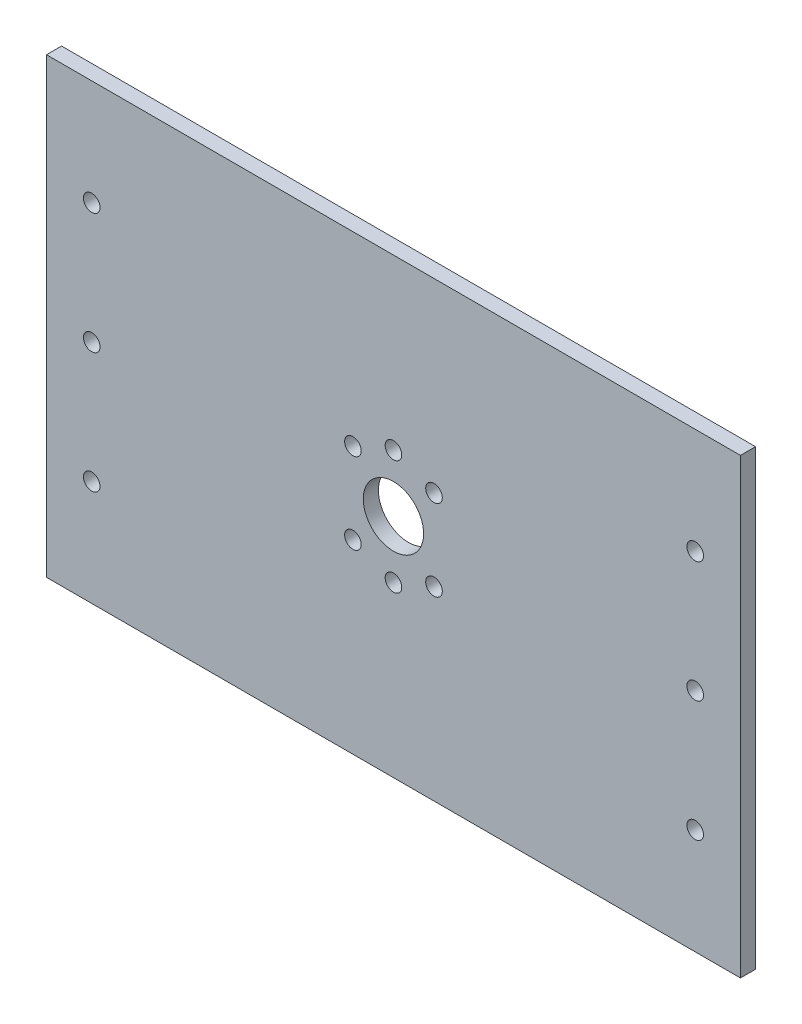
ISO-10303-21;
HEADER;
FILE_DESCRIPTION(('STEP AP214'),'2;1');
FILE_NAME('part.step','',(''),(''),'','','');
FILE_SCHEMA(('AUTOMOTIVE_DESIGN { 1 0 10303 214 1 1 1 1 }'));
ENDSEC;
DATA;
#1=APPLICATION_CONTEXT('core data for automotive mechanical design processes');
#2=APPLICATION_PROTOCOL_DEFINITION('international standard','automotive_design',2000,#1);
#3=PRODUCT_CONTEXT('',#1,'mechanical');
#4=PRODUCT('Part','Part','',(#3));
#5=PRODUCT_RELATED_PRODUCT_CATEGORY('part','',(#4));
#6=PRODUCT_DEFINITION_FORMATION('','',#4);
#7=PRODUCT_DEFINITION_CONTEXT('part definition',#1,'design');
#8=PRODUCT_DEFINITION('design','',#6,#7);
#9=PRODUCT_DEFINITION_SHAPE('','',#8);
#10=(LENGTH_UNIT() NAMED_UNIT(*) SI_UNIT(.MILLI.,.METRE.));
#11=(NAMED_UNIT(*) PLANE_ANGLE_UNIT() SI_UNIT($,.RADIAN.));
#12=(NAMED_UNIT(*) SI_UNIT($,.STERADIAN.) SOLID_ANGLE_UNIT());
#13=UNCERTAINTY_MEASURE_WITH_UNIT(LENGTH_MEASURE(1.E-05),#10,'distance_accuracy_value','');
#14=(GEOMETRIC_REPRESENTATION_CONTEXT(3) GLOBAL_UNCERTAINTY_ASSIGNED_CONTEXT((#13)) GLOBAL_UNIT_ASSIGNED_CONTEXT((#10,
#11,#12)) REPRESENTATION_CONTEXT('',''));
#15=CARTESIAN_POINT('',(0.,0.,0.));
#16=DIRECTION('',(0.,0.,1.));
#17=DIRECTION('',(1.,0.,0.));
#18=AXIS2_PLACEMENT_3D('',#15,#16,#17);
#19=CARTESIAN_POINT('',(0.,0.,5.));
#20=DIRECTION('',(0.,0.,1.));
#21=DIRECTION('',(1.,0.,0.));
#22=AXIS2_PLACEMENT_3D('',#19,#20,#21);
#23=PLANE('',#22);
#24=CARTESIAN_POINT('',(100.,0.,5.));
#25=DIRECTION('',(0.,0.,1.));
#26=DIRECTION('',(-1.,0.,0.));
#27=AXIS2_PLACEMENT_3D('',#24,#25,#26);
#28=CIRCLE('',#27,2.75000000000001);
#29=CARTESIAN_POINT('',(97.25,0.,5.));
#30=VERTEX_POINT('',#29);
#31=EDGE_CURVE('E178',#30,#30,#28,.T.);
#32=ORIENTED_EDGE('',*,*,#31,.F.);
#33=EDGE_LOOP('',(#32));
#34=FACE_BOUND('',#33,.T.);
#35=CARTESIAN_POINT('',(-100.,-40.,5.));
#36=DIRECTION('',(0.,0.,1.));
#37=DIRECTION('',(-1.,0.,0.));
#38=AXIS2_PLACEMENT_3D('',#35,#36,#37);
#39=CIRCLE('',#38,2.75000000000001);
#40=CARTESIAN_POINT('',(-102.75,-40.,5.));
#41=VERTEX_POINT('',#40);
#42=EDGE_CURVE('E166',#41,#41,#39,.T.);
#43=ORIENTED_EDGE('',*,*,#42,.F.);
#44=EDGE_LOOP('',(#43));
#45=FACE_BOUND('',#44,.T.);
#46=CARTESIAN_POINT('',(-100.,0.,5.));
#47=DIRECTION('',(0.,0.,1.));
#48=DIRECTION('',(1.,0.,0.));
#49=AXIS2_PLACEMENT_3D('',#46,#47,#48);
#50=CIRCLE('',#49,2.75000000000001);
#51=CARTESIAN_POINT('',(-97.25,0.,5.));
#52=VERTEX_POINT('',#51);
#53=EDGE_CURVE('E154',#52,#52,#50,.T.);
#54=ORIENTED_EDGE('',*,*,#53,.F.);
#55=EDGE_LOOP('',(#54));
#56=FACE_BOUND('',#55,.T.);
#57=CARTESIAN_POINT('',(-13.4350288425445,-13.4350288425443,5.));
#58=DIRECTION('',(0.,0.,1.));
#59=DIRECTION('',(1.,0.,0.));
#60=AXIS2_PLACEMENT_3D('',#57,#58,#59);
#61=CIRCLE('',#60,2.75);
#62=CARTESIAN_POINT('',(-10.6850288425445,-13.4350288425443,5.));
#63=VERTEX_POINT('',#62);
#64=EDGE_CURVE('E142',#63,#63,#61,.T.);
#65=ORIENTED_EDGE('',*,*,#64,.F.);
#66=EDGE_LOOP('',(#65));
#67=FACE_BOUND('',#66,.T.);
#68=CARTESIAN_POINT('',(-13.4350288425445,13.4350288425443,5.));
#69=DIRECTION('',(0.,0.,1.));
#70=DIRECTION('',(-1.,0.,0.));
#71=AXIS2_PLACEMENT_3D('',#68,#69,#70);
#72=CIRCLE('',#71,2.75);
#73=CARTESIAN_POINT('',(-16.1850288425445,13.4350288425443,5.));
#74=VERTEX_POINT('',#73);
#75=EDGE_CURVE('E130',#74,#74,#72,.T.);
#76=ORIENTED_EDGE('',*,*,#75,.F.);
#77=EDGE_LOOP('',(#76));
#78=FACE_BOUND('',#77,.T.);
#79=CARTESIAN_POINT('',(0.,19.,5.));
#80=DIRECTION('',(0.,0.,1.));
#81=DIRECTION('',(1.,0.,0.));
#82=AXIS2_PLACEMENT_3D('',#79,#80,#81);
#83=CIRCLE('',#82,2.75);
#84=CARTESIAN_POINT('',(2.75,19.,5.));
#85=VERTEX_POINT('',#84);
#86=EDGE_CURVE('E118',#85,#85,#83,.T.);
#87=ORIENTED_EDGE('',*,*,#86,.F.);
#88=EDGE_LOOP('',(#87));
#89=FACE_BOUND('',#88,.T.);
#90=DIRECTION('',(0.,-1.,0.));
#91=VECTOR('',#90,1.);
#92=CARTESIAN_POINT('',(-115.,-75.,5.));
#93=LINE('',#92,#91);
#94=CARTESIAN_POINT('',(-115.,75.,5.));
#95=VERTEX_POINT('',#94);
#96=CARTESIAN_POINT('',(-115.,-75.,5.));
#97=VERTEX_POINT('',#96);
#98=EDGE_CURVE('E88',#95,#97,#93,.T.);
#99=ORIENTED_EDGE('',*,*,#98,.T.);
#100=DIRECTION('',(1.,0.,0.));
#101=VECTOR('',#100,1.);
#102=CARTESIAN_POINT('',(115.,-75.,5.));
#103=LINE('',#102,#101);
#104=CARTESIAN_POINT('',(115.,-75.,5.));
#105=VERTEX_POINT('',#104);
#106=EDGE_CURVE('E83',#97,#105,#103,.T.);
#107=ORIENTED_EDGE('',*,*,#106,.T.);
#108=DIRECTION('',(0.,1.,0.));
#109=VECTOR('',#108,1.);
#110=CARTESIAN_POINT('',(115.,-75.,5.));
#111=LINE('',#110,#109);
#112=CARTESIAN_POINT('',(115.,75.,5.));
#113=VERTEX_POINT('',#112);
#114=EDGE_CURVE('E86',#105,#113,#111,.T.);
#115=ORIENTED_EDGE('',*,*,#114,.T.);
#116=DIRECTION('',(-1.,0.,0.));
#117=VECTOR('',#116,1.);
#118=CARTESIAN_POINT('',(115.,75.,5.));
#119=LINE('',#118,#117);
#120=EDGE_CURVE('E53',#113,#95,#119,.T.);
#121=ORIENTED_EDGE('',*,*,#120,.T.);
#122=EDGE_LOOP('',(#99,#107,#115,#121));
#123=FACE_BOUND('',#122,.T.);
#124=CARTESIAN_POINT('',(0.,0.,5.));
#125=DIRECTION('',(0.,0.,1.));
#126=DIRECTION('',(1.,0.,0.));
#127=AXIS2_PLACEMENT_3D('',#124,#125,#126);
#128=CIRCLE('',#127,10.);
#129=CARTESIAN_POINT('',(10.,0.,5.));
#130=VERTEX_POINT('',#129);
#131=EDGE_CURVE('E103',#130,#130,#128,.T.);
#132=ORIENTED_EDGE('',*,*,#131,.F.);
#133=EDGE_LOOP('',(#132));
#134=FACE_BOUND('',#133,.T.);
#135=CARTESIAN_POINT('',(13.4350288425445,13.4350288425443,5.));
#136=DIRECTION('',(0.,0.,1.));
#137=DIRECTION('',(1.,0.,0.));
#138=AXIS2_PLACEMENT_3D('',#135,#136,#137);
#139=CIRCLE('',#138,2.75);
#140=CARTESIAN_POINT('',(16.1850288425445,13.4350288425443,5.));
#141=VERTEX_POINT('',#140);
#142=EDGE_CURVE('E124',#141,#141,#139,.T.);
#143=ORIENTED_EDGE('',*,*,#142,.F.);
#144=EDGE_LOOP('',(#143));
#145=FACE_BOUND('',#144,.T.);
#146=CARTESIAN_POINT('',(13.4350288425445,-13.4350288425443,5.));
#147=DIRECTION('',(0.,0.,1.));
#148=DIRECTION('',(-1.,0.,0.));
#149=AXIS2_PLACEMENT_3D('',#146,#147,#148);
#150=CIRCLE('',#149,2.75);
#151=CARTESIAN_POINT('',(10.6850288425445,-13.4350288425443,5.));
#152=VERTEX_POINT('',#151);
#153=EDGE_CURVE('E136',#152,#152,#150,.T.);
#154=ORIENTED_EDGE('',*,*,#153,.F.);
#155=EDGE_LOOP('',(#154));
#156=FACE_BOUND('',#155,.T.);
#157=CARTESIAN_POINT('',(0.,-19.,5.));
#158=DIRECTION('',(0.,0.,1.));
#159=DIRECTION('',(-1.,0.,0.));
#160=AXIS2_PLACEMENT_3D('',#157,#158,#159);
#161=CIRCLE('',#160,2.75);
#162=CARTESIAN_POINT('',(-2.75,-19.,5.));
#163=VERTEX_POINT('',#162);
#164=EDGE_CURVE('E148',#163,#163,#161,.T.);
#165=ORIENTED_EDGE('',*,*,#164,.F.);
#166=EDGE_LOOP('',(#165));
#167=FACE_BOUND('',#166,.T.);
#168=CARTESIAN_POINT('',(-100.,40.,5.));
#169=DIRECTION('',(0.,0.,1.));
#170=DIRECTION('',(1.,0.,0.));
#171=AXIS2_PLACEMENT_3D('',#168,#169,#170);
#172=CIRCLE('',#171,2.75000000000001);
#173=CARTESIAN_POINT('',(-97.25,40.,5.));
#174=VERTEX_POINT('',#173);
#175=EDGE_CURVE('E160',#174,#174,#172,.T.);
#176=ORIENTED_EDGE('',*,*,#175,.F.);
#177=EDGE_LOOP('',(#176));
#178=FACE_BOUND('',#177,.T.);
#179=CARTESIAN_POINT('',(100.,-40.,5.));
#180=DIRECTION('',(0.,0.,1.));
#181=DIRECTION('',(1.,0.,0.));
#182=AXIS2_PLACEMENT_3D('',#179,#180,#181);
#183=CIRCLE('',#182,2.75000000000001);
#184=CARTESIAN_POINT('',(102.75,-40.,5.));
#185=VERTEX_POINT('',#184);
#186=EDGE_CURVE('E172',#185,#185,#183,.T.);
#187=ORIENTED_EDGE('',*,*,#186,.F.);
#188=EDGE_LOOP('',(#187));
#189=FACE_BOUND('',#188,.T.);
#190=CARTESIAN_POINT('',(100.,40.,5.));
#191=DIRECTION('',(0.,0.,1.));
#192=DIRECTION('',(-1.,0.,0.));
#193=AXIS2_PLACEMENT_3D('',#190,#191,#192);
#194=CIRCLE('',#193,2.75000000000001);
#195=CARTESIAN_POINT('',(97.25,40.,5.));
#196=VERTEX_POINT('',#195);
#197=EDGE_CURVE('E184',#196,#196,#194,.T.);
#198=ORIENTED_EDGE('',*,*,#197,.F.);
#199=EDGE_LOOP('',(#198));
#200=FACE_BOUND('',#199,.T.);
#201=ADVANCED_FACE('F36',(#34,#45,#56,#67,#78,#89,#123,#134,#145,#156,#167,#178,#189,#200),#23,.T.);
#202=CARTESIAN_POINT('',(0.,0.,0.));
#203=DIRECTION('',(0.,0.,1.));
#204=DIRECTION('',(1.,0.,0.));
#205=AXIS2_PLACEMENT_3D('',#202,#203,#204);
#206=PLANE('',#205);
#207=DIRECTION('',(0.,-1.,0.));
#208=VECTOR('',#207,1.);
#209=CARTESIAN_POINT('',(-115.,-75.,0.));
#210=LINE('',#209,#208);
#211=CARTESIAN_POINT('',(-115.,75.,0.));
#212=VERTEX_POINT('',#211);
#213=CARTESIAN_POINT('',(-115.,-75.,0.));
#214=VERTEX_POINT('',#213);
#215=EDGE_CURVE('E100',#212,#214,#210,.T.);
#216=ORIENTED_EDGE('',*,*,#215,.F.);
#217=DIRECTION('',(-1.,0.,0.));
#218=VECTOR('',#217,1.);
#219=CARTESIAN_POINT('',(115.,75.,0.));
#220=LINE('',#219,#218);
#221=CARTESIAN_POINT('',(115.,75.,0.));
#222=VERTEX_POINT('',#221);
#223=EDGE_CURVE('E76',#222,#212,#220,.T.);
#224=ORIENTED_EDGE('',*,*,#223,.F.);
#225=DIRECTION('',(0.,1.,0.));
#226=VECTOR('',#225,1.);
#227=CARTESIAN_POINT('',(115.,-75.,0.));
#228=LINE('',#227,#226);
#229=CARTESIAN_POINT('',(115.,-75.,0.));
#230=VERTEX_POINT('',#229);
#231=EDGE_CURVE('E70',#230,#222,#228,.T.);
#232=ORIENTED_EDGE('',*,*,#231,.F.);
#233=DIRECTION('',(1.,0.,0.));
#234=VECTOR('',#233,1.);
#235=CARTESIAN_POINT('',(115.,-75.,0.));
#236=LINE('',#235,#234);
#237=EDGE_CURVE('E92',#214,#230,#236,.T.);
#238=ORIENTED_EDGE('',*,*,#237,.F.);
#239=EDGE_LOOP('',(#216,#224,#232,#238));
#240=FACE_BOUND('',#239,.T.);
#241=CARTESIAN_POINT('',(0.,0.,0.));
#242=DIRECTION('',(0.,0.,1.));
#243=DIRECTION('',(1.,0.,0.));
#244=AXIS2_PLACEMENT_3D('',#241,#242,#243);
#245=CIRCLE('',#244,10.);
#246=CARTESIAN_POINT('',(10.,0.,0.));
#247=VERTEX_POINT('',#246);
#248=EDGE_CURVE('E115',#247,#247,#245,.T.);
#249=ORIENTED_EDGE('',*,*,#248,.T.);
#250=EDGE_LOOP('',(#249));
#251=FACE_BOUND('',#250,.T.);
#252=CARTESIAN_POINT('',(0.,19.,0.));
#253=DIRECTION('',(0.,0.,1.));
#254=DIRECTION('',(1.,0.,0.));
#255=AXIS2_PLACEMENT_3D('',#252,#253,#254);
#256=CIRCLE('',#255,2.75);
#257=CARTESIAN_POINT('',(2.75,19.,0.));
#258=VERTEX_POINT('',#257);
#259=EDGE_CURVE('E121',#258,#258,#256,.T.);
#260=ORIENTED_EDGE('',*,*,#259,.T.);
#261=EDGE_LOOP('',(#260));
#262=FACE_BOUND('',#261,.T.);
#263=CARTESIAN_POINT('',(13.4350288425445,13.4350288425443,0.));
#264=DIRECTION('',(0.,0.,1.));
#265=DIRECTION('',(1.,0.,0.));
#266=AXIS2_PLACEMENT_3D('',#263,#264,#265);
#267=CIRCLE('',#266,2.75);
#268=CARTESIAN_POINT('',(16.1850288425445,13.4350288425443,0.));
#269=VERTEX_POINT('',#268);
#270=EDGE_CURVE('E127',#269,#269,#267,.T.);
#271=ORIENTED_EDGE('',*,*,#270,.T.);
#272=EDGE_LOOP('',(#271));
#273=FACE_BOUND('',#272,.T.);
#274=CARTESIAN_POINT('',(-13.4350288425445,13.4350288425443,0.));
#275=DIRECTION('',(0.,0.,1.));
#276=DIRECTION('',(-1.,0.,0.));
#277=AXIS2_PLACEMENT_3D('',#274,#275,#276);
#278=CIRCLE('',#277,2.75);
#279=CARTESIAN_POINT('',(-16.1850288425445,13.4350288425443,0.));
#280=VERTEX_POINT('',#279);
#281=EDGE_CURVE('E133',#280,#280,#278,.T.);
#282=ORIENTED_EDGE('',*,*,#281,.T.);
#283=EDGE_LOOP('',(#282));
#284=FACE_BOUND('',#283,.T.);
#285=CARTESIAN_POINT('',(13.4350288425445,-13.4350288425443,0.));
#286=DIRECTION('',(0.,0.,1.));
#287=DIRECTION('',(-1.,0.,0.));
#288=AXIS2_PLACEMENT_3D('',#285,#286,#287);
#289=CIRCLE('',#288,2.75);
#290=CARTESIAN_POINT('',(10.6850288425445,-13.4350288425443,0.));
#291=VERTEX_POINT('',#290);
#292=EDGE_CURVE('E139',#291,#291,#289,.T.);
#293=ORIENTED_EDGE('',*,*,#292,.T.);
#294=EDGE_LOOP('',(#293));
#295=FACE_BOUND('',#294,.T.);
#296=CARTESIAN_POINT('',(-13.4350288425445,-13.4350288425443,0.));
#297=DIRECTION('',(0.,0.,1.));
#298=DIRECTION('',(1.,0.,0.));
#299=AXIS2_PLACEMENT_3D('',#296,#297,#298);
#300=CIRCLE('',#299,2.75);
#301=CARTESIAN_POINT('',(-10.6850288425445,-13.4350288425443,0.));
#302=VERTEX_POINT('',#301);
#303=EDGE_CURVE('E145',#302,#302,#300,.T.);
#304=ORIENTED_EDGE('',*,*,#303,.T.);
#305=EDGE_LOOP('',(#304));
#306=FACE_BOUND('',#305,.T.);
#307=CARTESIAN_POINT('',(0.,-19.,0.));
#308=DIRECTION('',(0.,0.,1.));
#309=DIRECTION('',(-1.,0.,0.));
#310=AXIS2_PLACEMENT_3D('',#307,#308,#309);
#311=CIRCLE('',#310,2.75);
#312=CARTESIAN_POINT('',(-2.75,-19.,0.));
#313=VERTEX_POINT('',#312);
#314=EDGE_CURVE('E151',#313,#313,#311,.T.);
#315=ORIENTED_EDGE('',*,*,#314,.T.);
#316=EDGE_LOOP('',(#315));
#317=FACE_BOUND('',#316,.T.);
#318=CARTESIAN_POINT('',(-100.,0.,0.));
#319=DIRECTION('',(0.,0.,1.));
#320=DIRECTION('',(1.,0.,0.));
#321=AXIS2_PLACEMENT_3D('',#318,#319,#320);
#322=CIRCLE('',#321,2.75000000000001);
#323=CARTESIAN_POINT('',(-97.25,0.,0.));
#324=VERTEX_POINT('',#323);
#325=EDGE_CURVE('E157',#324,#324,#322,.T.);
#326=ORIENTED_EDGE('',*,*,#325,.T.);
#327=EDGE_LOOP('',(#326));
#328=FACE_BOUND('',#327,.T.);
#329=CARTESIAN_POINT('',(-100.,40.,0.));
#330=DIRECTION('',(0.,0.,1.));
#331=DIRECTION('',(1.,0.,0.));
#332=AXIS2_PLACEMENT_3D('',#329,#330,#331);
#333=CIRCLE('',#332,2.75000000000001);
#334=CARTESIAN_POINT('',(-97.25,40.,0.));
#335=VERTEX_POINT('',#334);
#336=EDGE_CURVE('E163',#335,#335,#333,.T.);
#337=ORIENTED_EDGE('',*,*,#336,.T.);
#338=EDGE_LOOP('',(#337));
#339=FACE_BOUND('',#338,.T.);
#340=CARTESIAN_POINT('',(-100.,-40.,0.));
#341=DIRECTION('',(0.,0.,1.));
#342=DIRECTION('',(-1.,0.,0.));
#343=AXIS2_PLACEMENT_3D('',#340,#341,#342);
#344=CIRCLE('',#343,2.75000000000001);
#345=CARTESIAN_POINT('',(-102.75,-40.,0.));
#346=VERTEX_POINT('',#345);
#347=EDGE_CURVE('E169',#346,#346,#344,.T.);
#348=ORIENTED_EDGE('',*,*,#347,.T.);
#349=EDGE_LOOP('',(#348));
#350=FACE_BOUND('',#349,.T.);
#351=CARTESIAN_POINT('',(100.,-40.,0.));
#352=DIRECTION('',(0.,0.,1.));
#353=DIRECTION('',(1.,0.,0.));
#354=AXIS2_PLACEMENT_3D('',#351,#352,#353);
#355=CIRCLE('',#354,2.75000000000001);
#356=CARTESIAN_POINT('',(102.75,-40.,0.));
#357=VERTEX_POINT('',#356);
#358=EDGE_CURVE('E175',#357,#357,#355,.T.);
#359=ORIENTED_EDGE('',*,*,#358,.T.);
#360=EDGE_LOOP('',(#359));
#361=FACE_BOUND('',#360,.T.);
#362=CARTESIAN_POINT('',(100.,0.,0.));
#363=DIRECTION('',(0.,0.,1.));
#364=DIRECTION('',(-1.,0.,0.));
#365=AXIS2_PLACEMENT_3D('',#362,#363,#364);
#366=CIRCLE('',#365,2.75000000000001);
#367=CARTESIAN_POINT('',(97.25,0.,0.));
#368=VERTEX_POINT('',#367);
#369=EDGE_CURVE('E181',#368,#368,#366,.T.);
#370=ORIENTED_EDGE('',*,*,#369,.T.);
#371=EDGE_LOOP('',(#370));
#372=FACE_BOUND('',#371,.T.);
#373=CARTESIAN_POINT('',(100.,40.,0.));
#374=DIRECTION('',(0.,0.,1.));
#375=DIRECTION('',(-1.,0.,0.));
#376=AXIS2_PLACEMENT_3D('',#373,#374,#375);
#377=CIRCLE('',#376,2.75000000000001);
#378=CARTESIAN_POINT('',(97.25,40.,0.));
#379=VERTEX_POINT('',#378);
#380=EDGE_CURVE('E187',#379,#379,#377,.T.);
#381=ORIENTED_EDGE('',*,*,#380,.T.);
#382=EDGE_LOOP('',(#381));
#383=FACE_BOUND('',#382,.T.);
#384=ADVANCED_FACE('F111',(#240,#251,#262,#273,#284,#295,#306,#317,#328,#339,#350,#361,#372,
#383),#206,.F.);
#385=CARTESIAN_POINT('',(-115.,-75.,5.));
#386=DIRECTION('',(1.,0.,0.));
#387=DIRECTION('',(0.,1.,0.));
#388=AXIS2_PLACEMENT_3D('',#385,#386,#387);
#389=PLANE('',#388);
#390=ORIENTED_EDGE('',*,*,#215,.T.);
#391=DIRECTION('',(0.,0.,-1.));
#392=VECTOR('',#391,1.);
#393=CARTESIAN_POINT('',(-115.,-75.,5.));
#394=LINE('',#393,#392);
#395=EDGE_CURVE('E11',#97,#214,#394,.T.);
#396=ORIENTED_EDGE('',*,*,#395,.F.);
#397=ORIENTED_EDGE('',*,*,#98,.F.);
#398=DIRECTION('',(0.,0.,-1.));
#399=VECTOR('',#398,1.);
#400=CARTESIAN_POINT('',(-115.,75.,5.));
#401=LINE('',#400,#399);
#402=EDGE_CURVE('E96',#95,#212,#401,.T.);
#403=ORIENTED_EDGE('',*,*,#402,.T.);
#404=EDGE_LOOP('',(#390,#396,#397,#403));
#405=FACE_BOUND('',#404,.T.);
#406=ADVANCED_FACE('F38',(#405),#389,.F.);
#407=CARTESIAN_POINT('',(115.,-75.,5.));
#408=DIRECTION('',(0.,1.,0.));
#409=DIRECTION('',(-1.,0.,0.));
#410=AXIS2_PLACEMENT_3D('',#407,#408,#409);
#411=PLANE('',#410);
#412=ORIENTED_EDGE('',*,*,#237,.T.);
#413=DIRECTION('',(0.,0.,-1.));
#414=VECTOR('',#413,1.);
#415=CARTESIAN_POINT('',(115.,-75.,5.));
#416=LINE('',#415,#414);
#417=EDGE_CURVE('E45',#105,#230,#416,.T.);
#418=ORIENTED_EDGE('',*,*,#417,.F.);
#419=ORIENTED_EDGE('',*,*,#106,.F.);
#420=ORIENTED_EDGE('',*,*,#395,.T.);
#421=EDGE_LOOP('',(#412,#418,#419,#420));
#422=FACE_BOUND('',#421,.T.);
#423=ADVANCED_FACE('F91',(#422),#411,.F.);
#424=CARTESIAN_POINT('',(115.,-75.,5.));
#425=DIRECTION('',(-1.,0.,0.));
#426=DIRECTION('',(0.,-1.,0.));
#427=AXIS2_PLACEMENT_3D('',#424,#425,#426);
#428=PLANE('',#427);
#429=ORIENTED_EDGE('',*,*,#231,.T.);
#430=DIRECTION('',(0.,0.,-1.));
#431=VECTOR('',#430,1.);
#432=CARTESIAN_POINT('',(115.,75.,5.));
#433=LINE('',#432,#431);
#434=EDGE_CURVE('E93',#113,#222,#433,.T.);
#435=ORIENTED_EDGE('',*,*,#434,.F.);
#436=ORIENTED_EDGE('',*,*,#114,.F.);
#437=ORIENTED_EDGE('',*,*,#417,.T.);
#438=EDGE_LOOP('',(#429,#435,#436,#437));
#439=FACE_BOUND('',#438,.T.);
#440=ADVANCED_FACE('F94',(#439),#428,.F.);
#441=CARTESIAN_POINT('',(115.,75.,5.));
#442=DIRECTION('',(0.,-1.,0.));
#443=DIRECTION('',(1.,0.,0.));
#444=AXIS2_PLACEMENT_3D('',#441,#442,#443);
#445=PLANE('',#444);
#446=ORIENTED_EDGE('',*,*,#223,.T.);
#447=ORIENTED_EDGE('',*,*,#402,.F.);
#448=ORIENTED_EDGE('',*,*,#120,.F.);
#449=ORIENTED_EDGE('',*,*,#434,.T.);
#450=EDGE_LOOP('',(#446,#447,#448,#449));
#451=FACE_BOUND('',#450,.T.);
#452=ADVANCED_FACE('F108',(#451),#445,.F.);
#453=CARTESIAN_POINT('',(0.,0.,5.));
#454=DIRECTION('',(0.,0.,-1.));
#455=DIRECTION('',(-1.,0.,0.));
#456=AXIS2_PLACEMENT_3D('',#453,#454,#455);
#457=CYLINDRICAL_SURFACE('',#456,10.);
#458=ORIENTED_EDGE('',*,*,#131,.T.);
#459=EDGE_LOOP('',(#458));
#460=FACE_BOUND('',#459,.T.);
#461=ORIENTED_EDGE('',*,*,#248,.F.);
#462=EDGE_LOOP('',(#461));
#463=FACE_BOUND('',#462,.T.);
#464=ADVANCED_FACE('F206',(#460,#463),#457,.F.);
#465=CARTESIAN_POINT('',(0.,19.,5.));
#466=DIRECTION('',(0.,0.,-1.));
#467=DIRECTION('',(-1.,0.,0.));
#468=AXIS2_PLACEMENT_3D('',#465,#466,#467);
#469=CYLINDRICAL_SURFACE('',#468,2.75);
#470=ORIENTED_EDGE('',*,*,#86,.T.);
#471=EDGE_LOOP('',(#470));
#472=FACE_BOUND('',#471,.T.);
#473=ORIENTED_EDGE('',*,*,#259,.F.);
#474=EDGE_LOOP('',(#473));
#475=FACE_BOUND('',#474,.T.);
#476=ADVANCED_FACE('F252',(#472,#475),#469,.F.);
#477=CARTESIAN_POINT('',(13.4350288425445,13.4350288425443,5.));
#478=DIRECTION('',(0.,0.,-1.));
#479=DIRECTION('',(-1.,0.,0.));
#480=AXIS2_PLACEMENT_3D('',#477,#478,#479);
#481=CYLINDRICAL_SURFACE('',#480,2.75);
#482=ORIENTED_EDGE('',*,*,#142,.T.);
#483=EDGE_LOOP('',(#482));
#484=FACE_BOUND('',#483,.T.);
#485=ORIENTED_EDGE('',*,*,#270,.F.);
#486=EDGE_LOOP('',(#485));
#487=FACE_BOUND('',#486,.T.);
#488=ADVANCED_FACE('F260',(#484,#487),#481,.F.);
#489=CARTESIAN_POINT('',(-13.4350288425445,13.4350288425443,5.));
#490=DIRECTION('',(0.,0.,-1.));
#491=DIRECTION('',(-1.,0.,0.));
#492=AXIS2_PLACEMENT_3D('',#489,#490,#491);
#493=CYLINDRICAL_SURFACE('',#492,2.75);
#494=ORIENTED_EDGE('',*,*,#75,.T.);
#495=EDGE_LOOP('',(#494));
#496=FACE_BOUND('',#495,.T.);
#497=ORIENTED_EDGE('',*,*,#281,.F.);
#498=EDGE_LOOP('',(#497));
#499=FACE_BOUND('',#498,.T.);
#500=ADVANCED_FACE('F268',(#496,#499),#493,.F.);
#501=CARTESIAN_POINT('',(13.4350288425445,-13.4350288425443,5.));
#502=DIRECTION('',(0.,0.,-1.));
#503=DIRECTION('',(-1.,0.,0.));
#504=AXIS2_PLACEMENT_3D('',#501,#502,#503);
#505=CYLINDRICAL_SURFACE('',#504,2.75);
#506=ORIENTED_EDGE('',*,*,#153,.T.);
#507=EDGE_LOOP('',(#506));
#508=FACE_BOUND('',#507,.T.);
#509=ORIENTED_EDGE('',*,*,#292,.F.);
#510=EDGE_LOOP('',(#509));
#511=FACE_BOUND('',#510,.T.);
#512=ADVANCED_FACE('F277',(#508,#511),#505,.F.);
#513=CARTESIAN_POINT('',(-13.4350288425445,-13.4350288425443,5.));
#514=DIRECTION('',(0.,0.,-1.));
#515=DIRECTION('',(-1.,0.,0.));
#516=AXIS2_PLACEMENT_3D('',#513,#514,#515);
#517=CYLINDRICAL_SURFACE('',#516,2.75);
#518=ORIENTED_EDGE('',*,*,#64,.T.);
#519=EDGE_LOOP('',(#518));
#520=FACE_BOUND('',#519,.T.);
#521=ORIENTED_EDGE('',*,*,#303,.F.);
#522=EDGE_LOOP('',(#521));
#523=FACE_BOUND('',#522,.T.);
#524=ADVANCED_FACE('F286',(#520,#523),#517,.F.);
#525=CARTESIAN_POINT('',(0.,-19.,5.));
#526=DIRECTION('',(0.,0.,-1.));
#527=DIRECTION('',(-1.,0.,0.));
#528=AXIS2_PLACEMENT_3D('',#525,#526,#527);
#529=CYLINDRICAL_SURFACE('',#528,2.75);
#530=ORIENTED_EDGE('',*,*,#164,.T.);
#531=EDGE_LOOP('',(#530));
#532=FACE_BOUND('',#531,.T.);
#533=ORIENTED_EDGE('',*,*,#314,.F.);
#534=EDGE_LOOP('',(#533));
#535=FACE_BOUND('',#534,.T.);
#536=ADVANCED_FACE('F295',(#532,#535),#529,.F.);
#537=CARTESIAN_POINT('',(-100.,0.,5.));
#538=DIRECTION('',(0.,0.,-1.));
#539=DIRECTION('',(-1.,0.,0.));
#540=AXIS2_PLACEMENT_3D('',#537,#538,#539);
#541=CYLINDRICAL_SURFACE('',#540,2.75000000000001);
#542=ORIENTED_EDGE('',*,*,#53,.T.);
#543=EDGE_LOOP('',(#542));
#544=FACE_BOUND('',#543,.T.);
#545=ORIENTED_EDGE('',*,*,#325,.F.);
#546=EDGE_LOOP('',(#545));
#547=FACE_BOUND('',#546,.T.);
#548=ADVANCED_FACE('F304',(#544,#547),#541,.F.);
#549=CARTESIAN_POINT('',(-100.,40.,5.));
#550=DIRECTION('',(0.,0.,-1.));
#551=DIRECTION('',(-1.,0.,0.));
#552=AXIS2_PLACEMENT_3D('',#549,#550,#551);
#553=CYLINDRICAL_SURFACE('',#552,2.75000000000001);
#554=ORIENTED_EDGE('',*,*,#175,.T.);
#555=EDGE_LOOP('',(#554));
#556=FACE_BOUND('',#555,.T.);
#557=ORIENTED_EDGE('',*,*,#336,.F.);
#558=EDGE_LOOP('',(#557));
#559=FACE_BOUND('',#558,.T.);
#560=ADVANCED_FACE('F313',(#556,#559),#553,.F.);
#561=CARTESIAN_POINT('',(-100.,-40.,5.));
#562=DIRECTION('',(0.,0.,-1.));
#563=DIRECTION('',(-1.,0.,0.));
#564=AXIS2_PLACEMENT_3D('',#561,#562,#563);
#565=CYLINDRICAL_SURFACE('',#564,2.75000000000001);
#566=ORIENTED_EDGE('',*,*,#42,.T.);
#567=EDGE_LOOP('',(#566));
#568=FACE_BOUND('',#567,.T.);
#569=ORIENTED_EDGE('',*,*,#347,.F.);
#570=EDGE_LOOP('',(#569));
#571=FACE_BOUND('',#570,.T.);
#572=ADVANCED_FACE('F322',(#568,#571),#565,.F.);
#573=CARTESIAN_POINT('',(100.,-40.,5.));
#574=DIRECTION('',(0.,0.,-1.));
#575=DIRECTION('',(-1.,0.,0.));
#576=AXIS2_PLACEMENT_3D('',#573,#574,#575);
#577=CYLINDRICAL_SURFACE('',#576,2.75000000000001);
#578=ORIENTED_EDGE('',*,*,#186,.T.);
#579=EDGE_LOOP('',(#578));
#580=FACE_BOUND('',#579,.T.);
#581=ORIENTED_EDGE('',*,*,#358,.F.);
#582=EDGE_LOOP('',(#581));
#583=FACE_BOUND('',#582,.T.);
#584=ADVANCED_FACE('F331',(#580,#583),#577,.F.);
#585=CARTESIAN_POINT('',(100.,0.,5.));
#586=DIRECTION('',(0.,0.,-1.));
#587=DIRECTION('',(-1.,0.,0.));
#588=AXIS2_PLACEMENT_3D('',#585,#586,#587);
#589=CYLINDRICAL_SURFACE('',#588,2.75000000000001);
#590=ORIENTED_EDGE('',*,*,#31,.T.);
#591=EDGE_LOOP('',(#590));
#592=FACE_BOUND('',#591,.T.);
#593=ORIENTED_EDGE('',*,*,#369,.F.);
#594=EDGE_LOOP('',(#593));
#595=FACE_BOUND('',#594,.T.);
#596=ADVANCED_FACE('F340',(#592,#595),#589,.F.);
#597=CARTESIAN_POINT('',(100.,40.,5.));
#598=DIRECTION('',(0.,0.,-1.));
#599=DIRECTION('',(-1.,0.,0.));
#600=AXIS2_PLACEMENT_3D('',#597,#598,#599);
#601=CYLINDRICAL_SURFACE('',#600,2.75000000000001);
#602=ORIENTED_EDGE('',*,*,#197,.T.);
#603=EDGE_LOOP('',(#602));
#604=FACE_BOUND('',#603,.T.);
#605=ORIENTED_EDGE('',*,*,#380,.F.);
#606=EDGE_LOOP('',(#605));
#607=FACE_BOUND('',#606,.T.);
#608=ADVANCED_FACE('F193',(#604,#607),#601,.F.);
#609=CLOSED_SHELL('',(#201,#384,#406,#423,#440,#452,#464,#476,#488,#500,#512,#524,#536,#548,
#560,#572,#584,#596,#608));
#610=MANIFOLD_SOLID_BREP('B2',#609);
#611=ADVANCED_BREP_SHAPE_REPRESENTATION('',(#18,#610),#14);
#612=SHAPE_DEFINITION_REPRESENTATION(#9,#611);
ENDSEC;
END-ISO-10303-21;
